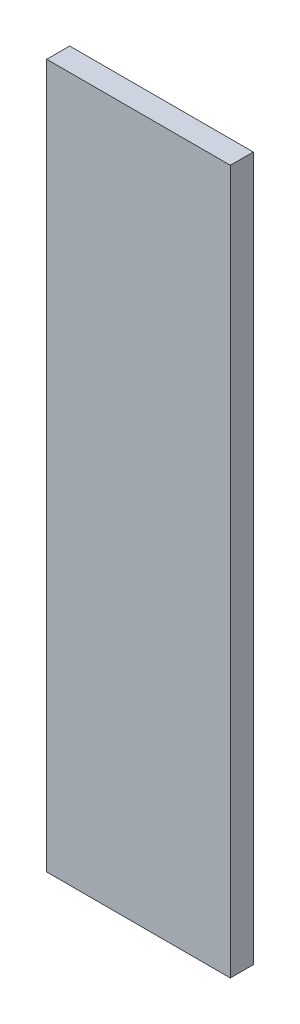
ISO-10303-21;
HEADER;
FILE_DESCRIPTION(('STEP AP214'),'2;1');
FILE_NAME('part.step','',(''),(''),'','','');
FILE_SCHEMA(('AUTOMOTIVE_DESIGN { 1 0 10303 214 1 1 1 1 }'));
ENDSEC;
DATA;
#1=APPLICATION_CONTEXT('core data for automotive mechanical design processes');
#2=APPLICATION_PROTOCOL_DEFINITION('international standard','automotive_design',2000,#1);
#3=PRODUCT_CONTEXT('',#1,'mechanical');
#4=PRODUCT('Part','Part','',(#3));
#5=PRODUCT_RELATED_PRODUCT_CATEGORY('part','',(#4));
#6=PRODUCT_DEFINITION_FORMATION('','',#4);
#7=PRODUCT_DEFINITION_CONTEXT('part definition',#1,'design');
#8=PRODUCT_DEFINITION('design','',#6,#7);
#9=PRODUCT_DEFINITION_SHAPE('','',#8);
#10=(LENGTH_UNIT() NAMED_UNIT(*) SI_UNIT(.MILLI.,.METRE.));
#11=(NAMED_UNIT(*) PLANE_ANGLE_UNIT() SI_UNIT($,.RADIAN.));
#12=(NAMED_UNIT(*) SI_UNIT($,.STERADIAN.) SOLID_ANGLE_UNIT());
#13=UNCERTAINTY_MEASURE_WITH_UNIT(LENGTH_MEASURE(1.E-05),#10,'distance_accuracy_value','');
#14=(GEOMETRIC_REPRESENTATION_CONTEXT(3) GLOBAL_UNCERTAINTY_ASSIGNED_CONTEXT((#13)) GLOBAL_UNIT_ASSIGNED_CONTEXT((#10,
#11,#12)) REPRESENTATION_CONTEXT('',''));
#15=CARTESIAN_POINT('',(0.,0.,0.));
#16=DIRECTION('',(0.,0.,1.));
#17=DIRECTION('',(1.,0.,0.));
#18=AXIS2_PLACEMENT_3D('',#15,#16,#17);
#19=CARTESIAN_POINT('',(36.0059551658626,18.9727016457973,1.7018));
#20=DIRECTION('',(-1.,0.,0.));
#21=DIRECTION('',(0.,0.,1.));
#22=AXIS2_PLACEMENT_3D('',#19,#20,#21);
#23=PLANE('',#22);
#24=DIRECTION('',(0.,1.,0.));
#25=VECTOR('',#24,1.);
#26=CARTESIAN_POINT('',(36.0059551658626,15.9066874318148,1.7018));
#27=LINE('',#26,#25);
#28=CARTESIAN_POINT('',(36.0059551658626,15.9066874318148,1.7018));
#29=VERTEX_POINT('',#28);
#30=CARTESIAN_POINT('',(36.0059551658626,18.9727016457973,1.7018));
#31=VERTEX_POINT('',#30);
#32=EDGE_CURVE('E92',#29,#31,#27,.T.);
#33=ORIENTED_EDGE('',*,*,#32,.F.);
#34=DIRECTION('',(0.,0.,1.));
#35=VECTOR('',#34,1.);
#36=CARTESIAN_POINT('',(36.0059551658626,15.9066874318148,1.7018));
#37=LINE('',#36,#35);
#38=CARTESIAN_POINT('',(36.0059551658626,15.9066874318148,1.8018));
#39=VERTEX_POINT('',#38);
#40=EDGE_CURVE('E78',#29,#39,#37,.T.);
#41=ORIENTED_EDGE('',*,*,#40,.T.);
#42=DIRECTION('',(0.,-1.,0.));
#43=VECTOR('',#42,1.);
#44=CARTESIAN_POINT('',(36.0059551658626,15.9066874318148,1.8018));
#45=LINE('',#44,#43);
#46=CARTESIAN_POINT('',(36.0059551658626,18.9727016457973,1.8018));
#47=VERTEX_POINT('',#46);
#48=EDGE_CURVE('E79',#47,#39,#45,.T.);
#49=ORIENTED_EDGE('',*,*,#48,.F.);
#50=DIRECTION('',(0.,0.,1.));
#51=VECTOR('',#50,1.);
#52=CARTESIAN_POINT('',(36.0059551658626,18.9727016457973,1.7018));
#53=LINE('',#52,#51);
#54=EDGE_CURVE('E11',#31,#47,#53,.T.);
#55=ORIENTED_EDGE('',*,*,#54,.F.);
#56=EDGE_LOOP('',(#33,#41,#49,#55));
#57=FACE_BOUND('',#56,.T.);
#58=ADVANCED_FACE('F16',(#57),#23,.T.);
#59=CARTESIAN_POINT('',(36.8057849608147,18.9727016457973,1.7018));
#60=DIRECTION('',(0.,1.,0.));
#61=DIRECTION('',(1.,0.,0.));
#62=AXIS2_PLACEMENT_3D('',#59,#60,#61);
#63=PLANE('',#62);
#64=DIRECTION('',(1.,0.,0.));
#65=VECTOR('',#64,1.);
#66=CARTESIAN_POINT('',(36.0059551658626,18.9727016457973,1.7018));
#67=LINE('',#66,#65);
#68=CARTESIAN_POINT('',(36.8057849608147,18.9727016457973,1.7018));
#69=VERTEX_POINT('',#68);
#70=EDGE_CURVE('E86',#31,#69,#67,.T.);
#71=ORIENTED_EDGE('',*,*,#70,.F.);
#72=ORIENTED_EDGE('',*,*,#54,.T.);
#73=DIRECTION('',(-1.,0.,0.));
#74=VECTOR('',#73,1.);
#75=CARTESIAN_POINT('',(36.0059551658626,18.9727016457973,1.8018));
#76=LINE('',#75,#74);
#77=CARTESIAN_POINT('',(36.8057849608147,18.9727016457973,1.8018));
#78=VERTEX_POINT('',#77);
#79=EDGE_CURVE('E101',#78,#47,#76,.T.);
#80=ORIENTED_EDGE('',*,*,#79,.F.);
#81=DIRECTION('',(0.,0.,1.));
#82=VECTOR('',#81,1.);
#83=CARTESIAN_POINT('',(36.8057849608147,18.9727016457973,1.7018));
#84=LINE('',#83,#82);
#85=EDGE_CURVE('E26',#69,#78,#84,.T.);
#86=ORIENTED_EDGE('',*,*,#85,.F.);
#87=EDGE_LOOP('',(#71,#72,#80,#86));
#88=FACE_BOUND('',#87,.T.);
#89=ADVANCED_FACE('F193',(#88),#63,.T.);
#90=CARTESIAN_POINT('',(36.8057849608147,15.9066874318148,1.7018));
#91=DIRECTION('',(1.,0.,0.));
#92=DIRECTION('',(0.,1.,0.));
#93=AXIS2_PLACEMENT_3D('',#90,#91,#92);
#94=PLANE('',#93);
#95=DIRECTION('',(0.,-1.,0.));
#96=VECTOR('',#95,1.);
#97=CARTESIAN_POINT('',(36.8057849608147,18.9727016457973,1.7018));
#98=LINE('',#97,#96);
#99=CARTESIAN_POINT('',(36.8057849608147,15.9066874318148,1.7018));
#100=VERTEX_POINT('',#99);
#101=EDGE_CURVE('E19',#69,#100,#98,.T.);
#102=ORIENTED_EDGE('',*,*,#101,.F.);
#103=ORIENTED_EDGE('',*,*,#85,.T.);
#104=DIRECTION('',(0.,1.,0.));
#105=VECTOR('',#104,1.);
#106=CARTESIAN_POINT('',(36.8057849608147,18.9727016457973,1.8018));
#107=LINE('',#106,#105);
#108=CARTESIAN_POINT('',(36.8057849608147,15.9066874318148,1.8018));
#109=VERTEX_POINT('',#108);
#110=EDGE_CURVE('E72',#109,#78,#107,.T.);
#111=ORIENTED_EDGE('',*,*,#110,.F.);
#112=DIRECTION('',(0.,0.,1.));
#113=VECTOR('',#112,1.);
#114=CARTESIAN_POINT('',(36.8057849608147,15.9066874318148,1.7018));
#115=LINE('',#114,#113);
#116=EDGE_CURVE('E67',#100,#109,#115,.T.);
#117=ORIENTED_EDGE('',*,*,#116,.F.);
#118=EDGE_LOOP('',(#102,#103,#111,#117));
#119=FACE_BOUND('',#118,.T.);
#120=ADVANCED_FACE('F69',(#119),#94,.T.);
#121=CARTESIAN_POINT('',(36.0059551658626,15.9066874318148,1.7018));
#122=DIRECTION('',(0.,-1.,0.));
#123=DIRECTION('',(0.,0.,-1.));
#124=AXIS2_PLACEMENT_3D('',#121,#122,#123);
#125=PLANE('',#124);
#126=DIRECTION('',(-1.,0.,0.));
#127=VECTOR('',#126,1.);
#128=CARTESIAN_POINT('',(36.8057849608147,15.9066874318148,1.7018));
#129=LINE('',#128,#127);
#130=EDGE_CURVE('E85',#100,#29,#129,.T.);
#131=ORIENTED_EDGE('',*,*,#130,.F.);
#132=ORIENTED_EDGE('',*,*,#116,.T.);
#133=DIRECTION('',(1.,0.,0.));
#134=VECTOR('',#133,1.);
#135=CARTESIAN_POINT('',(36.8057849608147,15.9066874318148,1.8018));
#136=LINE('',#135,#134);
#137=EDGE_CURVE('E88',#39,#109,#136,.T.);
#138=ORIENTED_EDGE('',*,*,#137,.F.);
#139=ORIENTED_EDGE('',*,*,#40,.F.);
#140=EDGE_LOOP('',(#131,#132,#138,#139));
#141=FACE_BOUND('',#140,.T.);
#142=ADVANCED_FACE('F89',(#141),#125,.T.);
#143=CARTESIAN_POINT('',(36.4058700633388,17.4396945388061,1.8018));
#144=DIRECTION('',(0.,0.,1.));
#145=DIRECTION('',(1.,0.,0.));
#146=AXIS2_PLACEMENT_3D('',#143,#144,#145);
#147=PLANE('',#146);
#148=ORIENTED_EDGE('',*,*,#137,.T.);
#149=ORIENTED_EDGE('',*,*,#110,.T.);
#150=ORIENTED_EDGE('',*,*,#79,.T.);
#151=ORIENTED_EDGE('',*,*,#48,.T.);
#152=EDGE_LOOP('',(#148,#149,#150,#151));
#153=FACE_BOUND('',#152,.T.);
#154=ADVANCED_FACE('F125',(#153),#147,.T.);
#155=CARTESIAN_POINT('',(36.4058700633388,17.4396945388061,1.7018));
#156=DIRECTION('',(0.,0.,1.));
#157=DIRECTION('',(1.,0.,0.));
#158=AXIS2_PLACEMENT_3D('',#155,#156,#157);
#159=PLANE('',#158);
#160=ORIENTED_EDGE('',*,*,#130,.T.);
#161=ORIENTED_EDGE('',*,*,#32,.T.);
#162=ORIENTED_EDGE('',*,*,#70,.T.);
#163=ORIENTED_EDGE('',*,*,#101,.T.);
#164=EDGE_LOOP('',(#160,#161,#162,#163));
#165=FACE_BOUND('',#164,.T.);
#166=ADVANCED_FACE('F83',(#165),#159,.F.);
#167=CLOSED_SHELL('',(#58,#89,#120,#142,#154,#166));
#168=MANIFOLD_SOLID_BREP('B1',#167);
#169=ADVANCED_BREP_SHAPE_REPRESENTATION('',(#18,#168),#14);
#170=SHAPE_DEFINITION_REPRESENTATION(#9,#169);
ENDSEC;
END-ISO-10303-21;
